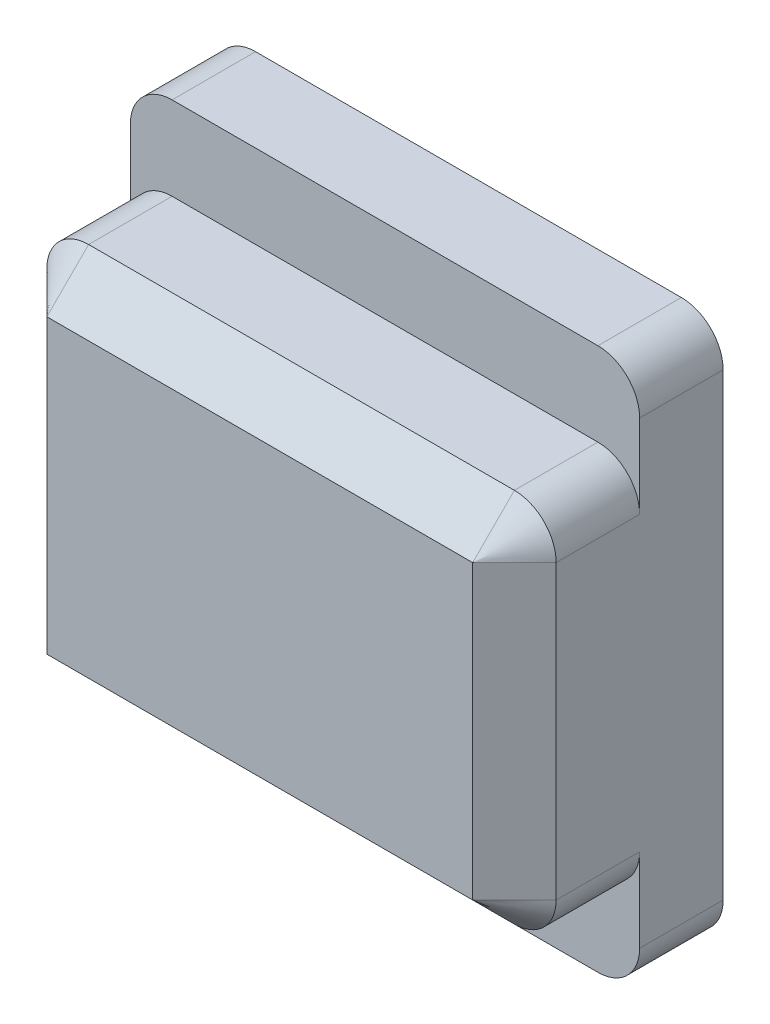
ISO-10303-21;
HEADER;
FILE_DESCRIPTION(('STEP AP214'),'2;1');
FILE_NAME('part.step','',(''),(''),'','','');
FILE_SCHEMA(('AUTOMOTIVE_DESIGN { 1 0 10303 214 1 1 1 1 }'));
ENDSEC;
DATA;
#1=APPLICATION_CONTEXT('core data for automotive mechanical design processes');
#2=APPLICATION_PROTOCOL_DEFINITION('international standard','automotive_design',2000,#1);
#3=PRODUCT_CONTEXT('',#1,'mechanical');
#4=PRODUCT('Part','Part','',(#3));
#5=PRODUCT_RELATED_PRODUCT_CATEGORY('part','',(#4));
#6=PRODUCT_DEFINITION_FORMATION('','',#4);
#7=PRODUCT_DEFINITION_CONTEXT('part definition',#1,'design');
#8=PRODUCT_DEFINITION('design','',#6,#7);
#9=PRODUCT_DEFINITION_SHAPE('','',#8);
#10=(LENGTH_UNIT() NAMED_UNIT(*) SI_UNIT(.MILLI.,.METRE.));
#11=(NAMED_UNIT(*) PLANE_ANGLE_UNIT() SI_UNIT($,.RADIAN.));
#12=(NAMED_UNIT(*) SI_UNIT($,.STERADIAN.) SOLID_ANGLE_UNIT());
#13=UNCERTAINTY_MEASURE_WITH_UNIT(LENGTH_MEASURE(1.E-05),#10,'distance_accuracy_value','');
#14=(GEOMETRIC_REPRESENTATION_CONTEXT(3) GLOBAL_UNCERTAINTY_ASSIGNED_CONTEXT((#13)) GLOBAL_UNIT_ASSIGNED_CONTEXT((#10,
#11,#12)) REPRESENTATION_CONTEXT('',''));
#15=CARTESIAN_POINT('',(0.,0.,0.));
#16=DIRECTION('',(0.,0.,1.));
#17=DIRECTION('',(1.,0.,0.));
#18=AXIS2_PLACEMENT_3D('',#15,#16,#17);
#19=CARTESIAN_POINT('',(7.9,-0.100000000000001,-2.5));
#20=DIRECTION('',(0.,1.,0.));
#21=DIRECTION('',(-1.,0.,0.));
#22=AXIS2_PLACEMENT_3D('',#19,#20,#21);
#23=PLANE('',#22);
#24=DIRECTION('',(0.,0.,1.));
#25=VECTOR('',#24,1.);
#26=CARTESIAN_POINT('',(-2.55,-0.100000000000001,-2.5));
#27=LINE('',#26,#25);
#28=CARTESIAN_POINT('',(-2.55,-0.100000000000001,-1.5));
#29=VERTEX_POINT('',#28);
#30=CARTESIAN_POINT('',(-2.55,-0.100000000000001,-0.500000000000002));
#31=VERTEX_POINT('',#30);
#32=EDGE_CURVE('E202',#29,#31,#27,.T.);
#33=ORIENTED_EDGE('',*,*,#32,.T.);
#34=DIRECTION('',(1.,0.,0.));
#35=VECTOR('',#34,1.);
#36=CARTESIAN_POINT('',(7.9,-0.100000000000001,-0.500000000000002));
#37=LINE('',#36,#35);
#38=CARTESIAN_POINT('',(2.55,-0.100000000000001,-0.500000000000002));
#39=VERTEX_POINT('',#38);
#40=EDGE_CURVE('E286',#31,#39,#37,.T.);
#41=ORIENTED_EDGE('',*,*,#40,.T.);
#42=DIRECTION('',(0.,0.,1.));
#43=VECTOR('',#42,1.);
#44=CARTESIAN_POINT('',(2.55,-0.100000000000001,-1.5));
#45=LINE('',#44,#43);
#46=CARTESIAN_POINT('',(2.55,-0.100000000000001,-1.5));
#47=VERTEX_POINT('',#46);
#48=EDGE_CURVE('E264',#39,#47,#45,.F.);
#49=ORIENTED_EDGE('',*,*,#48,.T.);
#50=DIRECTION('',(-1.,0.,0.));
#51=VECTOR('',#50,1.);
#52=CARTESIAN_POINT('',(7.9,-0.100000000000001,-1.5));
#53=LINE('',#52,#51);
#54=EDGE_CURVE('E208',#47,#29,#53,.T.);
#55=ORIENTED_EDGE('',*,*,#54,.T.);
#56=EDGE_LOOP('',(#33,#41,#49,#55));
#57=FACE_BOUND('',#56,.T.);
#58=ADVANCED_FACE('F60',(#57),#23,.T.);
#59=CARTESIAN_POINT('',(-7.9,-4.6,-2.5));
#60=DIRECTION('',(0.,-1.,0.));
#61=DIRECTION('',(0.,0.,-1.));
#62=AXIS2_PLACEMENT_3D('',#59,#60,#61);
#63=PLANE('',#62);
#64=DIRECTION('',(0.,0.,-1.));
#65=VECTOR('',#64,1.);
#66=CARTESIAN_POINT('',(2.55,-4.6,0.));
#67=LINE('',#66,#65);
#68=CARTESIAN_POINT('',(2.55,-4.6,-1.5));
#69=VERTEX_POINT('',#68);
#70=CARTESIAN_POINT('',(2.55,-4.6,-0.500000000000002));
#71=VERTEX_POINT('',#70);
#72=EDGE_CURVE('E193',#69,#71,#67,.F.);
#73=ORIENTED_EDGE('',*,*,#72,.T.);
#74=DIRECTION('',(-1.,0.,0.));
#75=VECTOR('',#74,1.);
#76=CARTESIAN_POINT('',(-7.9,-4.6,-0.500000000000002));
#77=LINE('',#76,#75);
#78=CARTESIAN_POINT('',(-2.55,-4.6,-0.500000000000002));
#79=VERTEX_POINT('',#78);
#80=EDGE_CURVE('E84',#71,#79,#77,.T.);
#81=ORIENTED_EDGE('',*,*,#80,.T.);
#82=DIRECTION('',(0.,0.,-1.));
#83=VECTOR('',#82,1.);
#84=CARTESIAN_POINT('',(-2.55,-4.6,-2.5));
#85=LINE('',#84,#83);
#86=CARTESIAN_POINT('',(-2.55,-4.6,-1.5));
#87=VERTEX_POINT('',#86);
#88=EDGE_CURVE('E185',#79,#87,#85,.T.);
#89=ORIENTED_EDGE('',*,*,#88,.T.);
#90=DIRECTION('',(1.,0.,0.));
#91=VECTOR('',#90,1.);
#92=CARTESIAN_POINT('',(-7.9,-4.6,-1.5));
#93=LINE('',#92,#91);
#94=EDGE_CURVE('E189',#87,#69,#93,.T.);
#95=ORIENTED_EDGE('',*,*,#94,.T.);
#96=EDGE_LOOP('',(#73,#81,#89,#95));
#97=FACE_BOUND('',#96,.T.);
#98=ADVANCED_FACE('F187',(#97),#63,.T.);
#99=CARTESIAN_POINT('',(-7.9,-1.25,-2.5));
#100=DIRECTION('',(0.,0.,1.));
#101=DIRECTION('',(1.,0.,0.));
#102=AXIS2_PLACEMENT_3D('',#99,#100,#101);
#103=PLANE('',#102);
#104=DIRECTION('',(0.,1.,0.));
#105=VECTOR('',#104,1.);
#106=CARTESIAN_POINT('',(3.05,-5.6,-2.5));
#107=LINE('',#106,#105);
#108=CARTESIAN_POINT('',(3.05,-5.1,-2.5));
#109=VERTEX_POINT('',#108);
#110=CARTESIAN_POINT('',(3.05,0.399999999999998,-2.5));
#111=VERTEX_POINT('',#110);
#112=EDGE_CURVE('E323',#109,#111,#107,.T.);
#113=ORIENTED_EDGE('',*,*,#112,.F.);
#114=CARTESIAN_POINT('',(2.55,-5.1,-2.5));
#115=DIRECTION('',(0.,0.,1.));
#116=DIRECTION('',(1.,0.,0.));
#117=AXIS2_PLACEMENT_3D('',#114,#115,#116);
#118=CIRCLE('',#117,0.5);
#119=CARTESIAN_POINT('',(2.55,-5.6,-2.5));
#120=VERTEX_POINT('',#119);
#121=EDGE_CURVE('E244',#109,#120,#118,.F.);
#122=ORIENTED_EDGE('',*,*,#121,.T.);
#123=DIRECTION('',(-1.,0.,0.));
#124=VECTOR('',#123,1.);
#125=CARTESIAN_POINT('',(7.9,-5.6,-2.5));
#126=LINE('',#125,#124);
#127=CARTESIAN_POINT('',(-2.55,-5.6,-2.5));
#128=VERTEX_POINT('',#127);
#129=EDGE_CURVE('E217',#120,#128,#126,.T.);
#130=ORIENTED_EDGE('',*,*,#129,.T.);
#131=CARTESIAN_POINT('',(-2.55,-5.1,-2.5));
#132=DIRECTION('',(0.,0.,1.));
#133=DIRECTION('',(1.,0.,0.));
#134=AXIS2_PLACEMENT_3D('',#131,#132,#133);
#135=CIRCLE('',#134,0.5);
#136=CARTESIAN_POINT('',(-3.05,-5.1,-2.5));
#137=VERTEX_POINT('',#136);
#138=EDGE_CURVE('E242',#128,#137,#135,.F.);
#139=ORIENTED_EDGE('',*,*,#138,.T.);
#140=DIRECTION('',(0.,1.,0.));
#141=VECTOR('',#140,1.);
#142=CARTESIAN_POINT('',(-3.05,-5.6,-2.5));
#143=LINE('',#142,#141);
#144=CARTESIAN_POINT('',(-3.05,0.399999999999998,-2.5));
#145=VERTEX_POINT('',#144);
#146=EDGE_CURVE('E318',#137,#145,#143,.T.);
#147=ORIENTED_EDGE('',*,*,#146,.T.);
#148=CARTESIAN_POINT('',(-2.55,0.399999999999998,-2.5));
#149=DIRECTION('',(0.,0.,1.));
#150=DIRECTION('',(1.,0.,0.));
#151=AXIS2_PLACEMENT_3D('',#148,#149,#150);
#152=CIRCLE('',#151,0.5);
#153=CARTESIAN_POINT('',(-2.55,0.899999999999998,-2.5));
#154=VERTEX_POINT('',#153);
#155=EDGE_CURVE('E240',#145,#154,#152,.F.);
#156=ORIENTED_EDGE('',*,*,#155,.T.);
#157=DIRECTION('',(1.,0.,0.));
#158=VECTOR('',#157,1.);
#159=CARTESIAN_POINT('',(7.9,0.899999999999998,-2.5));
#160=LINE('',#159,#158);
#161=CARTESIAN_POINT('',(2.55,0.899999999999998,-2.5));
#162=VERTEX_POINT('',#161);
#163=EDGE_CURVE('E341',#154,#162,#160,.T.);
#164=ORIENTED_EDGE('',*,*,#163,.T.);
#165=CARTESIAN_POINT('',(2.55,0.399999999999998,-2.5));
#166=DIRECTION('',(0.,0.,1.));
#167=DIRECTION('',(1.,0.,0.));
#168=AXIS2_PLACEMENT_3D('',#165,#166,#167);
#169=CIRCLE('',#168,0.5);
#170=EDGE_CURVE('E238',#162,#111,#169,.F.);
#171=ORIENTED_EDGE('',*,*,#170,.T.);
#172=EDGE_LOOP('',(#113,#122,#130,#139,#147,#156,#164,#171));
#173=FACE_BOUND('',#172,.T.);
#174=ADVANCED_FACE('F349',(#173),#103,.F.);
#175=CARTESIAN_POINT('',(-7.9,-1.25,0.));
#176=DIRECTION('',(0.,0.,1.));
#177=DIRECTION('',(1.,0.,0.));
#178=AXIS2_PLACEMENT_3D('',#175,#176,#177);
#179=PLANE('',#178);
#180=DIRECTION('',(0.,1.,0.));
#181=VECTOR('',#180,1.);
#182=CARTESIAN_POINT('',(2.55,-0.600000000000002,0.));
#183=LINE('',#182,#181);
#184=CARTESIAN_POINT('',(2.55,-4.1,0.));
#185=VERTEX_POINT('',#184);
#186=CARTESIAN_POINT('',(2.55,-0.600000000000002,0.));
#187=VERTEX_POINT('',#186);
#188=EDGE_CURVE('E281',#185,#187,#183,.T.);
#189=ORIENTED_EDGE('',*,*,#188,.T.);
#190=DIRECTION('',(-1.,0.,0.));
#191=VECTOR('',#190,1.);
#192=CARTESIAN_POINT('',(-7.9,-0.600000000000002,0.));
#193=LINE('',#192,#191);
#194=CARTESIAN_POINT('',(-2.55,-0.600000000000001,0.));
#195=VERTEX_POINT('',#194);
#196=EDGE_CURVE('E283',#187,#195,#193,.T.);
#197=ORIENTED_EDGE('',*,*,#196,.T.);
#198=DIRECTION('',(0.,-1.,0.));
#199=VECTOR('',#198,1.);
#200=CARTESIAN_POINT('',(-2.55,-1.25,0.));
#201=LINE('',#200,#199);
#202=CARTESIAN_POINT('',(-2.55,-4.1,0.));
#203=VERTEX_POINT('',#202);
#204=EDGE_CURVE('E277',#195,#203,#201,.T.);
#205=ORIENTED_EDGE('',*,*,#204,.T.);
#206=DIRECTION('',(1.,0.,0.));
#207=VECTOR('',#206,1.);
#208=CARTESIAN_POINT('',(-7.9,-4.1,0.));
#209=LINE('',#208,#207);
#210=EDGE_CURVE('E279',#203,#185,#209,.T.);
#211=ORIENTED_EDGE('',*,*,#210,.T.);
#212=EDGE_LOOP('',(#189,#197,#205,#211));
#213=FACE_BOUND('',#212,.T.);
#214=ADVANCED_FACE('F405',(#213),#179,.T.);
#215=CARTESIAN_POINT('',(7.9,-5.6,-1.5));
#216=DIRECTION('',(0.,-1.,0.));
#217=DIRECTION('',(0.,0.,-1.));
#218=AXIS2_PLACEMENT_3D('',#215,#216,#217);
#219=PLANE('',#218);
#220=ORIENTED_EDGE('',*,*,#129,.F.);
#221=DIRECTION('',(0.,0.,-1.));
#222=VECTOR('',#221,1.);
#223=CARTESIAN_POINT('',(2.55,-5.6,-1.5));
#224=LINE('',#223,#222);
#225=CARTESIAN_POINT('',(2.55,-5.6,-1.5));
#226=VERTEX_POINT('',#225);
#227=EDGE_CURVE('E249',#120,#226,#224,.F.);
#228=ORIENTED_EDGE('',*,*,#227,.T.);
#229=DIRECTION('',(-1.,0.,0.));
#230=VECTOR('',#229,1.);
#231=CARTESIAN_POINT('',(7.9,-5.6,-1.5));
#232=LINE('',#231,#230);
#233=CARTESIAN_POINT('',(-2.55,-5.6,-1.5));
#234=VERTEX_POINT('',#233);
#235=EDGE_CURVE('E209',#226,#234,#232,.T.);
#236=ORIENTED_EDGE('',*,*,#235,.T.);
#237=DIRECTION('',(0.,0.,-1.));
#238=VECTOR('',#237,1.);
#239=CARTESIAN_POINT('',(-2.55,-5.6,-1.5));
#240=LINE('',#239,#238);
#241=EDGE_CURVE('E246',#234,#128,#240,.T.);
#242=ORIENTED_EDGE('',*,*,#241,.T.);
#243=EDGE_LOOP('',(#220,#228,#236,#242));
#244=FACE_BOUND('',#243,.T.);
#245=ADVANCED_FACE('F352',(#244),#219,.T.);
#246=CARTESIAN_POINT('',(0.,0.,-1.5));
#247=DIRECTION('',(0.,0.,-1.));
#248=DIRECTION('',(-1.,0.,0.));
#249=AXIS2_PLACEMENT_3D('',#246,#247,#248);
#250=PLANE('',#249);
#251=ORIENTED_EDGE('',*,*,#235,.F.);
#252=CARTESIAN_POINT('',(2.55,-5.1,-1.5));
#253=DIRECTION('',(0.,0.,-1.));
#254=DIRECTION('',(-1.,0.,0.));
#255=AXIS2_PLACEMENT_3D('',#252,#253,#254);
#256=CIRCLE('',#255,0.5);
#257=CARTESIAN_POINT('',(3.05,-5.1,-1.5));
#258=VERTEX_POINT('',#257);
#259=EDGE_CURVE('E253',#226,#258,#256,.F.);
#260=ORIENTED_EDGE('',*,*,#259,.T.);
#261=DIRECTION('',(0.,1.,0.));
#262=VECTOR('',#261,1.);
#263=CARTESIAN_POINT('',(3.05,0.,-1.5));
#264=LINE('',#263,#262);
#265=CARTESIAN_POINT('',(3.05,-4.1,-1.5));
#266=VERTEX_POINT('',#265);
#267=EDGE_CURVE('E334',#258,#266,#264,.T.);
#268=ORIENTED_EDGE('',*,*,#267,.T.);
#269=CARTESIAN_POINT('',(2.55,-4.1,-1.5));
#270=DIRECTION('',(0.,0.,-1.));
#271=DIRECTION('',(-1.,0.,0.));
#272=AXIS2_PLACEMENT_3D('',#269,#270,#271);
#273=CIRCLE('',#272,0.5);
#274=EDGE_CURVE('E201',#266,#69,#273,.T.);
#275=ORIENTED_EDGE('',*,*,#274,.T.);
#276=ORIENTED_EDGE('',*,*,#94,.F.);
#277=CARTESIAN_POINT('',(-2.55,-4.1,-1.5));
#278=DIRECTION('',(0.,0.,-1.));
#279=DIRECTION('',(-1.,0.,0.));
#280=AXIS2_PLACEMENT_3D('',#277,#278,#279);
#281=CIRCLE('',#280,0.5);
#282=CARTESIAN_POINT('',(-3.05,-4.1,-1.5));
#283=VERTEX_POINT('',#282);
#284=EDGE_CURVE('E196',#87,#283,#281,.T.);
#285=ORIENTED_EDGE('',*,*,#284,.T.);
#286=DIRECTION('',(0.,1.,0.));
#287=VECTOR('',#286,1.);
#288=CARTESIAN_POINT('',(-3.05,0.,-1.5));
#289=LINE('',#288,#287);
#290=CARTESIAN_POINT('',(-3.05,-5.1,-1.5));
#291=VERTEX_POINT('',#290);
#292=EDGE_CURVE('E339',#291,#283,#289,.T.);
#293=ORIENTED_EDGE('',*,*,#292,.F.);
#294=CARTESIAN_POINT('',(-2.55,-5.1,-1.5));
#295=DIRECTION('',(0.,0.,-1.));
#296=DIRECTION('',(-1.,0.,0.));
#297=AXIS2_PLACEMENT_3D('',#294,#295,#296);
#298=CIRCLE('',#297,0.5);
#299=EDGE_CURVE('E251',#291,#234,#298,.F.);
#300=ORIENTED_EDGE('',*,*,#299,.T.);
#301=EDGE_LOOP('',(#251,#260,#268,#275,#276,#285,#293,#300));
#302=FACE_BOUND('',#301,.T.);
#303=ADVANCED_FACE('F205',(#302),#250,.F.);
#304=DIRECTION('',(1.,0.,0.));
#305=VECTOR('',#304,1.);
#306=CARTESIAN_POINT('',(7.9,0.899999999999998,-1.5));
#307=LINE('',#306,#305);
#308=CARTESIAN_POINT('',(-2.55,0.899999999999998,-1.5));
#309=VERTEX_POINT('',#308);
#310=CARTESIAN_POINT('',(2.55,0.899999999999998,-1.5));
#311=VERTEX_POINT('',#310);
#312=EDGE_CURVE('E214',#309,#311,#307,.T.);
#313=ORIENTED_EDGE('',*,*,#312,.F.);
#314=CARTESIAN_POINT('',(-2.55,0.399999999999998,-1.5));
#315=DIRECTION('',(0.,0.,-1.));
#316=DIRECTION('',(-1.,0.,0.));
#317=AXIS2_PLACEMENT_3D('',#314,#315,#316);
#318=CIRCLE('',#317,0.5);
#319=CARTESIAN_POINT('',(-3.05,0.399999999999998,-1.5));
#320=VERTEX_POINT('',#319);
#321=EDGE_CURVE('E262',#309,#320,#318,.F.);
#322=ORIENTED_EDGE('',*,*,#321,.T.);
#323=DIRECTION('',(0.,1.,0.));
#324=VECTOR('',#323,1.);
#325=CARTESIAN_POINT('',(-3.05,0.,-1.5));
#326=LINE('',#325,#324);
#327=CARTESIAN_POINT('',(-3.05,-0.600000000000001,-1.5));
#328=VERTEX_POINT('',#327);
#329=EDGE_CURVE('E336',#328,#320,#326,.T.);
#330=ORIENTED_EDGE('',*,*,#329,.F.);
#331=CARTESIAN_POINT('',(-2.55,-0.600000000000001,-1.5));
#332=DIRECTION('',(0.,0.,-1.));
#333=DIRECTION('',(-1.,0.,0.));
#334=AXIS2_PLACEMENT_3D('',#331,#332,#333);
#335=CIRCLE('',#334,0.5);
#336=EDGE_CURVE('E269',#328,#29,#335,.T.);
#337=ORIENTED_EDGE('',*,*,#336,.T.);
#338=ORIENTED_EDGE('',*,*,#54,.F.);
#339=CARTESIAN_POINT('',(2.55,-0.600000000000002,-1.5));
#340=DIRECTION('',(0.,0.,-1.));
#341=DIRECTION('',(-1.,0.,0.));
#342=AXIS2_PLACEMENT_3D('',#339,#340,#341);
#343=CIRCLE('',#342,0.5);
#344=CARTESIAN_POINT('',(3.05,-0.600000000000002,-1.5));
#345=VERTEX_POINT('',#344);
#346=EDGE_CURVE('E271',#47,#345,#343,.T.);
#347=ORIENTED_EDGE('',*,*,#346,.T.);
#348=DIRECTION('',(0.,1.,0.));
#349=VECTOR('',#348,1.);
#350=CARTESIAN_POINT('',(3.05,0.,-1.5));
#351=LINE('',#350,#349);
#352=CARTESIAN_POINT('',(3.05,0.399999999999998,-1.5));
#353=VERTEX_POINT('',#352);
#354=EDGE_CURVE('E329',#345,#353,#351,.T.);
#355=ORIENTED_EDGE('',*,*,#354,.T.);
#356=CARTESIAN_POINT('',(2.55,0.399999999999998,-1.5));
#357=DIRECTION('',(0.,0.,-1.));
#358=DIRECTION('',(-1.,0.,0.));
#359=AXIS2_PLACEMENT_3D('',#356,#357,#358);
#360=CIRCLE('',#359,0.5);
#361=EDGE_CURVE('E260',#353,#311,#360,.F.);
#362=ORIENTED_EDGE('',*,*,#361,.T.);
#363=EDGE_LOOP('',(#313,#322,#330,#337,#338,#347,#355,#362));
#364=FACE_BOUND('',#363,.T.);
#365=ADVANCED_FACE('F511',(#364),#250,.F.);
#366=CARTESIAN_POINT('',(7.9,0.899999999999998,-1.5));
#367=DIRECTION('',(0.,1.,0.));
#368=DIRECTION('',(0.,0.,1.));
#369=AXIS2_PLACEMENT_3D('',#366,#367,#368);
#370=PLANE('',#369);
#371=ORIENTED_EDGE('',*,*,#163,.F.);
#372=DIRECTION('',(0.,0.,1.));
#373=VECTOR('',#372,1.);
#374=CARTESIAN_POINT('',(-2.55,0.899999999999998,-1.5));
#375=LINE('',#374,#373);
#376=EDGE_CURVE('E257',#154,#309,#375,.T.);
#377=ORIENTED_EDGE('',*,*,#376,.T.);
#378=ORIENTED_EDGE('',*,*,#312,.T.);
#379=DIRECTION('',(0.,0.,1.));
#380=VECTOR('',#379,1.);
#381=CARTESIAN_POINT('',(2.55,0.899999999999998,-2.5));
#382=LINE('',#381,#380);
#383=EDGE_CURVE('E255',#311,#162,#382,.F.);
#384=ORIENTED_EDGE('',*,*,#383,.T.);
#385=EDGE_LOOP('',(#371,#377,#378,#384));
#386=FACE_BOUND('',#385,.T.);
#387=ADVANCED_FACE('F505',(#386),#370,.T.);
#388=CARTESIAN_POINT('',(3.05,-5.6,7.5));
#389=DIRECTION('',(-1.,0.,0.));
#390=DIRECTION('',(0.,0.,1.));
#391=AXIS2_PLACEMENT_3D('',#388,#389,#390);
#392=PLANE('',#391);
#393=DIRECTION('',(0.,0.,1.));
#394=VECTOR('',#393,1.);
#395=CARTESIAN_POINT('',(3.05,-0.600000000000002,0.));
#396=LINE('',#395,#394);
#397=CARTESIAN_POINT('',(3.05,-0.600000000000002,-0.500000000000002));
#398=VERTEX_POINT('',#397);
#399=EDGE_CURVE('E227',#345,#398,#396,.T.);
#400=ORIENTED_EDGE('',*,*,#399,.T.);
#401=DIRECTION('',(0.,-1.,0.));
#402=VECTOR('',#401,1.);
#403=CARTESIAN_POINT('',(3.05,-4.1,-0.500000000000002));
#404=LINE('',#403,#402);
#405=CARTESIAN_POINT('',(3.05,-4.1,-0.500000000000002));
#406=VERTEX_POINT('',#405);
#407=EDGE_CURVE('E290',#398,#406,#404,.T.);
#408=ORIENTED_EDGE('',*,*,#407,.T.);
#409=DIRECTION('',(0.,0.,-1.));
#410=VECTOR('',#409,1.);
#411=CARTESIAN_POINT('',(3.05,-4.1,-1.5));
#412=LINE('',#411,#410);
#413=EDGE_CURVE('E233',#406,#266,#412,.T.);
#414=ORIENTED_EDGE('',*,*,#413,.T.);
#415=ORIENTED_EDGE('',*,*,#267,.F.);
#416=DIRECTION('',(0.,0.,-1.));
#417=VECTOR('',#416,1.);
#418=CARTESIAN_POINT('',(3.05,-5.1,-2.5));
#419=LINE('',#418,#417);
#420=EDGE_CURVE('E235',#258,#109,#419,.T.);
#421=ORIENTED_EDGE('',*,*,#420,.T.);
#422=ORIENTED_EDGE('',*,*,#112,.T.);
#423=DIRECTION('',(0.,0.,1.));
#424=VECTOR('',#423,1.);
#425=CARTESIAN_POINT('',(3.05,0.399999999999998,-1.5));
#426=LINE('',#425,#424);
#427=EDGE_CURVE('E230',#111,#353,#426,.T.);
#428=ORIENTED_EDGE('',*,*,#427,.T.);
#429=ORIENTED_EDGE('',*,*,#354,.F.);
#430=EDGE_LOOP('',(#400,#408,#414,#415,#421,#422,#428,#429));
#431=FACE_BOUND('',#430,.T.);
#432=ADVANCED_FACE('F360',(#431),#392,.F.);
#433=CARTESIAN_POINT('',(-3.05,-5.6,7.5));
#434=DIRECTION('',(-1.,0.,0.));
#435=DIRECTION('',(0.,0.,1.));
#436=AXIS2_PLACEMENT_3D('',#433,#434,#435);
#437=PLANE('',#436);
#438=DIRECTION('',(0.,0.,-1.));
#439=VECTOR('',#438,1.);
#440=CARTESIAN_POINT('',(-3.05,-4.1,7.5));
#441=LINE('',#440,#439);
#442=CARTESIAN_POINT('',(-3.05,-4.1,-0.500000000000002));
#443=VERTEX_POINT('',#442);
#444=EDGE_CURVE('E198',#283,#443,#441,.F.);
#445=ORIENTED_EDGE('',*,*,#444,.T.);
#446=DIRECTION('',(0.,1.,0.));
#447=VECTOR('',#446,1.);
#448=CARTESIAN_POINT('',(-3.05,-5.6,-0.500000000000002));
#449=LINE('',#448,#447);
#450=CARTESIAN_POINT('',(-3.05,-0.600000000000001,-0.500000000000002));
#451=VERTEX_POINT('',#450);
#452=EDGE_CURVE('E12',#443,#451,#449,.T.);
#453=ORIENTED_EDGE('',*,*,#452,.T.);
#454=DIRECTION('',(0.,0.,1.));
#455=VECTOR('',#454,1.);
#456=CARTESIAN_POINT('',(-3.05,-0.600000000000001,7.5));
#457=LINE('',#456,#455);
#458=EDGE_CURVE('E192',#451,#328,#457,.F.);
#459=ORIENTED_EDGE('',*,*,#458,.T.);
#460=ORIENTED_EDGE('',*,*,#329,.T.);
#461=DIRECTION('',(0.,0.,1.));
#462=VECTOR('',#461,1.);
#463=CARTESIAN_POINT('',(-3.05,0.399999999999998,7.5));
#464=LINE('',#463,#462);
#465=EDGE_CURVE('E222',#320,#145,#464,.F.);
#466=ORIENTED_EDGE('',*,*,#465,.T.);
#467=ORIENTED_EDGE('',*,*,#146,.F.);
#468=DIRECTION('',(0.,0.,-1.));
#469=VECTOR('',#468,1.);
#470=CARTESIAN_POINT('',(-3.05,-5.1,7.5));
#471=LINE('',#470,#469);
#472=EDGE_CURVE('E224',#137,#291,#471,.F.);
#473=ORIENTED_EDGE('',*,*,#472,.T.);
#474=ORIENTED_EDGE('',*,*,#292,.T.);
#475=EDGE_LOOP('',(#445,#453,#459,#460,#466,#467,#473,#474));
#476=FACE_BOUND('',#475,.T.);
#477=ADVANCED_FACE('F377',(#476),#437,.T.);
#478=CARTESIAN_POINT('',(-2.55,-4.1,-2.5));
#479=DIRECTION('',(0.,0.,-1.));
#480=DIRECTION('',(-1.,0.,0.));
#481=AXIS2_PLACEMENT_3D('',#478,#479,#480);
#482=CYLINDRICAL_SURFACE('',#481,0.5);
#483=ORIENTED_EDGE('',*,*,#88,.F.);
#484=CARTESIAN_POINT('',(-2.55,-4.1,-0.500000000000002));
#485=DIRECTION('',(0.,0.,1.));
#486=DIRECTION('',(1.,0.,0.));
#487=AXIS2_PLACEMENT_3D('',#484,#485,#486);
#488=CIRCLE('',#487,0.5);
#489=EDGE_CURVE('E69',#79,#443,#488,.F.);
#490=ORIENTED_EDGE('',*,*,#489,.T.);
#491=ORIENTED_EDGE('',*,*,#444,.F.);
#492=ORIENTED_EDGE('',*,*,#284,.F.);
#493=EDGE_LOOP('',(#483,#490,#491,#492));
#494=FACE_BOUND('',#493,.T.);
#495=ADVANCED_FACE('F197',(#494),#482,.T.);
#496=CARTESIAN_POINT('',(2.55,-5.1,7.5));
#497=DIRECTION('',(0.,0.,1.));
#498=DIRECTION('',(1.,0.,0.));
#499=AXIS2_PLACEMENT_3D('',#496,#497,#498);
#500=CYLINDRICAL_SURFACE('',#499,0.5);
#501=ORIENTED_EDGE('',*,*,#259,.F.);
#502=ORIENTED_EDGE('',*,*,#227,.F.);
#503=ORIENTED_EDGE('',*,*,#121,.F.);
#504=ORIENTED_EDGE('',*,*,#420,.F.);
#505=EDGE_LOOP('',(#501,#502,#503,#504));
#506=FACE_BOUND('',#505,.T.);
#507=ADVANCED_FACE('F356',(#506),#500,.T.);
#508=CARTESIAN_POINT('',(-2.55,-5.1,-1.5));
#509=DIRECTION('',(0.,0.,-1.));
#510=DIRECTION('',(-1.,0.,0.));
#511=AXIS2_PLACEMENT_3D('',#508,#509,#510);
#512=CYLINDRICAL_SURFACE('',#511,0.5);
#513=ORIENTED_EDGE('',*,*,#299,.F.);
#514=ORIENTED_EDGE('',*,*,#472,.F.);
#515=ORIENTED_EDGE('',*,*,#138,.F.);
#516=ORIENTED_EDGE('',*,*,#241,.F.);
#517=EDGE_LOOP('',(#513,#514,#515,#516));
#518=FACE_BOUND('',#517,.T.);
#519=ADVANCED_FACE('F425',(#518),#512,.T.);
#520=CARTESIAN_POINT('',(2.55,-4.1,7.5));
#521=DIRECTION('',(0.,0.,1.));
#522=DIRECTION('',(1.,0.,0.));
#523=AXIS2_PLACEMENT_3D('',#520,#521,#522);
#524=CYLINDRICAL_SURFACE('',#523,0.5);
#525=ORIENTED_EDGE('',*,*,#413,.F.);
#526=CARTESIAN_POINT('',(2.55,-4.1,-0.500000000000002));
#527=DIRECTION('',(0.,0.,1.));
#528=DIRECTION('',(1.,0.,0.));
#529=AXIS2_PLACEMENT_3D('',#526,#527,#528);
#530=CIRCLE('',#529,0.5);
#531=EDGE_CURVE('E292',#406,#71,#530,.F.);
#532=ORIENTED_EDGE('',*,*,#531,.T.);
#533=ORIENTED_EDGE('',*,*,#72,.F.);
#534=ORIENTED_EDGE('',*,*,#274,.F.);
#535=EDGE_LOOP('',(#525,#532,#533,#534));
#536=FACE_BOUND('',#535,.T.);
#537=ADVANCED_FACE('F364',(#536),#524,.T.);
#538=CARTESIAN_POINT('',(-2.55,0.399999999999998,-1.5));
#539=DIRECTION('',(0.,0.,1.));
#540=DIRECTION('',(1.,0.,0.));
#541=AXIS2_PLACEMENT_3D('',#538,#539,#540);
#542=CYLINDRICAL_SURFACE('',#541,0.5);
#543=ORIENTED_EDGE('',*,*,#155,.F.);
#544=ORIENTED_EDGE('',*,*,#465,.F.);
#545=ORIENTED_EDGE('',*,*,#321,.F.);
#546=ORIENTED_EDGE('',*,*,#376,.F.);
#547=EDGE_LOOP('',(#543,#544,#545,#546));
#548=FACE_BOUND('',#547,.T.);
#549=ADVANCED_FACE('F431',(#548),#542,.T.);
#550=CARTESIAN_POINT('',(2.55,0.399999999999998,7.5));
#551=DIRECTION('',(0.,0.,-1.));
#552=DIRECTION('',(-1.,0.,0.));
#553=AXIS2_PLACEMENT_3D('',#550,#551,#552);
#554=CYLINDRICAL_SURFACE('',#553,0.5);
#555=ORIENTED_EDGE('',*,*,#170,.F.);
#556=ORIENTED_EDGE('',*,*,#383,.F.);
#557=ORIENTED_EDGE('',*,*,#361,.F.);
#558=ORIENTED_EDGE('',*,*,#427,.F.);
#559=EDGE_LOOP('',(#555,#556,#557,#558));
#560=FACE_BOUND('',#559,.T.);
#561=ADVANCED_FACE('F434',(#560),#554,.T.);
#562=CARTESIAN_POINT('',(-2.55,-0.600000000000001,-2.5));
#563=DIRECTION('',(0.,0.,1.));
#564=DIRECTION('',(1.,0.,0.));
#565=AXIS2_PLACEMENT_3D('',#562,#563,#564);
#566=CYLINDRICAL_SURFACE('',#565,0.5);
#567=ORIENTED_EDGE('',*,*,#458,.F.);
#568=CARTESIAN_POINT('',(-2.55,-0.600000000000001,-0.500000000000002));
#569=DIRECTION('',(0.,0.,1.));
#570=DIRECTION('',(1.,0.,0.));
#571=AXIS2_PLACEMENT_3D('',#568,#569,#570);
#572=CIRCLE('',#571,0.5);
#573=EDGE_CURVE('E274',#451,#31,#572,.F.);
#574=ORIENTED_EDGE('',*,*,#573,.T.);
#575=ORIENTED_EDGE('',*,*,#32,.F.);
#576=ORIENTED_EDGE('',*,*,#336,.F.);
#577=EDGE_LOOP('',(#567,#574,#575,#576));
#578=FACE_BOUND('',#577,.T.);
#579=ADVANCED_FACE('F382',(#578),#566,.T.);
#580=CARTESIAN_POINT('',(2.55,-0.600000000000002,7.5));
#581=DIRECTION('',(0.,0.,-1.));
#582=DIRECTION('',(-1.,0.,0.));
#583=AXIS2_PLACEMENT_3D('',#580,#581,#582);
#584=CYLINDRICAL_SURFACE('',#583,0.5);
#585=ORIENTED_EDGE('',*,*,#48,.F.);
#586=CARTESIAN_POINT('',(2.55,-0.600000000000002,-0.500000000000002));
#587=DIRECTION('',(0.,0.,1.));
#588=DIRECTION('',(1.,0.,0.));
#589=AXIS2_PLACEMENT_3D('',#586,#587,#588);
#590=CIRCLE('',#589,0.5);
#591=EDGE_CURVE('E288',#39,#398,#590,.F.);
#592=ORIENTED_EDGE('',*,*,#591,.T.);
#593=ORIENTED_EDGE('',*,*,#399,.F.);
#594=ORIENTED_EDGE('',*,*,#346,.F.);
#595=EDGE_LOOP('',(#585,#592,#593,#594));
#596=FACE_BOUND('',#595,.T.);
#597=ADVANCED_FACE('F398',(#596),#584,.T.);
#598=CARTESIAN_POINT('',(2.55,-4.1,-0.500000000000002));
#599=DIRECTION('',(0.,0.,-1.));
#600=DIRECTION('',(-1.,0.,0.));
#601=AXIS2_PLACEMENT_3D('',#598,#599,#600);
#602=CONICAL_SURFACE('',#601,0.500000000000001,0.785398163397447);
#603=DIRECTION('',(0.,0.707106781186547,0.707106781186548));
#604=VECTOR('',#603,1.);
#605=CARTESIAN_POINT('',(2.55,-4.6,-0.500000000000002));
#606=LINE('',#605,#604);
#607=EDGE_CURVE('E311',#71,#185,#606,.T.);
#608=ORIENTED_EDGE('',*,*,#607,.F.);
#609=ORIENTED_EDGE('',*,*,#531,.F.);
#610=DIRECTION('',(0.707106781186547,0.,-0.707106781186548));
#611=VECTOR('',#610,1.);
#612=CARTESIAN_POINT('',(2.55,-4.1,0.));
#613=LINE('',#612,#611);
#614=EDGE_CURVE('E64',#185,#406,#613,.T.);
#615=ORIENTED_EDGE('',*,*,#614,.F.);
#616=EDGE_LOOP('',(#608,#609,#615));
#617=FACE_BOUND('',#616,.T.);
#618=ADVANCED_FACE('F62',(#617),#602,.T.);
#619=CARTESIAN_POINT('',(3.05,-5.6,-0.500000000000002));
#620=DIRECTION('',(0.707106781186548,0.,0.707106781186547));
#621=DIRECTION('',(0.,1.,0.));
#622=AXIS2_PLACEMENT_3D('',#619,#620,#621);
#623=PLANE('',#622);
#624=ORIENTED_EDGE('',*,*,#614,.T.);
#625=ORIENTED_EDGE('',*,*,#407,.F.);
#626=DIRECTION('',(0.707106781186547,0.,-0.707106781186548));
#627=VECTOR('',#626,1.);
#628=CARTESIAN_POINT('',(2.55,-0.600000000000002,0.));
#629=LINE('',#628,#627);
#630=EDGE_CURVE('E309',#187,#398,#629,.T.);
#631=ORIENTED_EDGE('',*,*,#630,.F.);
#632=ORIENTED_EDGE('',*,*,#188,.F.);
#633=EDGE_LOOP('',(#624,#625,#631,#632));
#634=FACE_BOUND('',#633,.T.);
#635=ADVANCED_FACE('F403',(#634),#623,.T.);
#636=CARTESIAN_POINT('',(-7.9,-4.1,0.));
#637=DIRECTION('',(0.,0.707106781186548,-0.707106781186547));
#638=DIRECTION('',(1.,0.,0.));
#639=AXIS2_PLACEMENT_3D('',#636,#637,#638);
#640=PLANE('',#639);
#641=ORIENTED_EDGE('',*,*,#607,.T.);
#642=ORIENTED_EDGE('',*,*,#210,.F.);
#643=DIRECTION('',(0.,0.707106781186547,0.707106781186548));
#644=VECTOR('',#643,1.);
#645=CARTESIAN_POINT('',(-2.55,-4.6,-0.500000000000002));
#646=LINE('',#645,#644);
#647=EDGE_CURVE('E306',#79,#203,#646,.T.);
#648=ORIENTED_EDGE('',*,*,#647,.F.);
#649=ORIENTED_EDGE('',*,*,#80,.F.);
#650=EDGE_LOOP('',(#641,#642,#648,#649));
#651=FACE_BOUND('',#650,.T.);
#652=ADVANCED_FACE('F366',(#651),#640,.F.);
#653=CARTESIAN_POINT('',(2.55,-0.600000000000002,-0.500000000000002));
#654=DIRECTION('',(0.,0.,-1.));
#655=DIRECTION('',(-1.,0.,0.));
#656=AXIS2_PLACEMENT_3D('',#653,#654,#655);
#657=CONICAL_SURFACE('',#656,0.500000000000001,0.785398163397447);
#658=ORIENTED_EDGE('',*,*,#630,.T.);
#659=ORIENTED_EDGE('',*,*,#591,.F.);
#660=DIRECTION('',(0.,0.707106781186547,-0.707106781186548));
#661=VECTOR('',#660,1.);
#662=CARTESIAN_POINT('',(2.55,-0.600000000000002,0.));
#663=LINE('',#662,#661);
#664=EDGE_CURVE('E303',#187,#39,#663,.T.);
#665=ORIENTED_EDGE('',*,*,#664,.F.);
#666=EDGE_LOOP('',(#658,#659,#665));
#667=FACE_BOUND('',#666,.T.);
#668=ADVANCED_FACE('F401',(#667),#657,.T.);
#669=CARTESIAN_POINT('',(-2.55,-4.1,-0.500000000000002));
#670=DIRECTION('',(0.,0.,-1.));
#671=DIRECTION('',(-1.,0.,0.));
#672=AXIS2_PLACEMENT_3D('',#669,#670,#671);
#673=CONICAL_SURFACE('',#672,0.500000000000001,0.785398163397447);
#674=ORIENTED_EDGE('',*,*,#489,.F.);
#675=ORIENTED_EDGE('',*,*,#647,.T.);
#676=DIRECTION('',(0.707106781186547,0.,0.707106781186548));
#677=VECTOR('',#676,1.);
#678=CARTESIAN_POINT('',(-3.05,-4.1,-0.500000000000002));
#679=LINE('',#678,#677);
#680=EDGE_CURVE('E300',#443,#203,#679,.T.);
#681=ORIENTED_EDGE('',*,*,#680,.F.);
#682=EDGE_LOOP('',(#674,#675,#681));
#683=FACE_BOUND('',#682,.T.);
#684=ADVANCED_FACE('F369',(#683),#673,.T.);
#685=CARTESIAN_POINT('',(-7.9,-0.600000000000002,0.));
#686=DIRECTION('',(0.,-0.707106781186548,-0.707106781186547));
#687=DIRECTION('',(-1.,0.,0.));
#688=AXIS2_PLACEMENT_3D('',#685,#686,#687);
#689=PLANE('',#688);
#690=ORIENTED_EDGE('',*,*,#664,.T.);
#691=ORIENTED_EDGE('',*,*,#40,.F.);
#692=DIRECTION('',(0.,0.707106781186547,-0.707106781186548));
#693=VECTOR('',#692,1.);
#694=CARTESIAN_POINT('',(-2.55,-0.600000000000002,0.));
#695=LINE('',#694,#693);
#696=EDGE_CURVE('E298',#195,#31,#695,.T.);
#697=ORIENTED_EDGE('',*,*,#696,.F.);
#698=ORIENTED_EDGE('',*,*,#196,.F.);
#699=EDGE_LOOP('',(#690,#691,#697,#698));
#700=FACE_BOUND('',#699,.T.);
#701=ADVANCED_FACE('F390',(#700),#689,.F.);
#702=CARTESIAN_POINT('',(-2.55,-1.25,0.));
#703=DIRECTION('',(0.707106781186548,0.,-0.707106781186547));
#704=DIRECTION('',(0.,-1.,0.));
#705=AXIS2_PLACEMENT_3D('',#702,#703,#704);
#706=PLANE('',#705);
#707=ORIENTED_EDGE('',*,*,#680,.T.);
#708=ORIENTED_EDGE('',*,*,#204,.F.);
#709=DIRECTION('',(0.707106781186547,0.,0.707106781186548));
#710=VECTOR('',#709,1.);
#711=CARTESIAN_POINT('',(-3.05,-0.600000000000001,-0.500000000000002));
#712=LINE('',#711,#710);
#713=EDGE_CURVE('E296',#451,#195,#712,.T.);
#714=ORIENTED_EDGE('',*,*,#713,.F.);
#715=ORIENTED_EDGE('',*,*,#452,.F.);
#716=EDGE_LOOP('',(#707,#708,#714,#715));
#717=FACE_BOUND('',#716,.T.);
#718=ADVANCED_FACE('F374',(#717),#706,.F.);
#719=CARTESIAN_POINT('',(-2.55,-0.600000000000001,-0.500000000000002));
#720=DIRECTION('',(0.,0.,-1.));
#721=DIRECTION('',(-1.,0.,0.));
#722=AXIS2_PLACEMENT_3D('',#719,#720,#721);
#723=CONICAL_SURFACE('',#722,0.500000000000001,0.785398163397447);
#724=ORIENTED_EDGE('',*,*,#696,.T.);
#725=ORIENTED_EDGE('',*,*,#573,.F.);
#726=ORIENTED_EDGE('',*,*,#713,.T.);
#727=EDGE_LOOP('',(#724,#725,#726));
#728=FACE_BOUND('',#727,.T.);
#729=ADVANCED_FACE('F385',(#728),#723,.T.);
#730=CLOSED_SHELL('',(#58,#98,#174,#214,#245,#303,#365,#387,#432,#477,#495,#507,#519,#537,#549,
#561,#579,#597,#618,#635,#652,#668,#684,#701,#718,#729));
#731=MANIFOLD_SOLID_BREP('B2',#730);
#732=ADVANCED_BREP_SHAPE_REPRESENTATION('',(#18,#731),#14);
#733=SHAPE_DEFINITION_REPRESENTATION(#9,#732);
ENDSEC;
END-ISO-10303-21;
